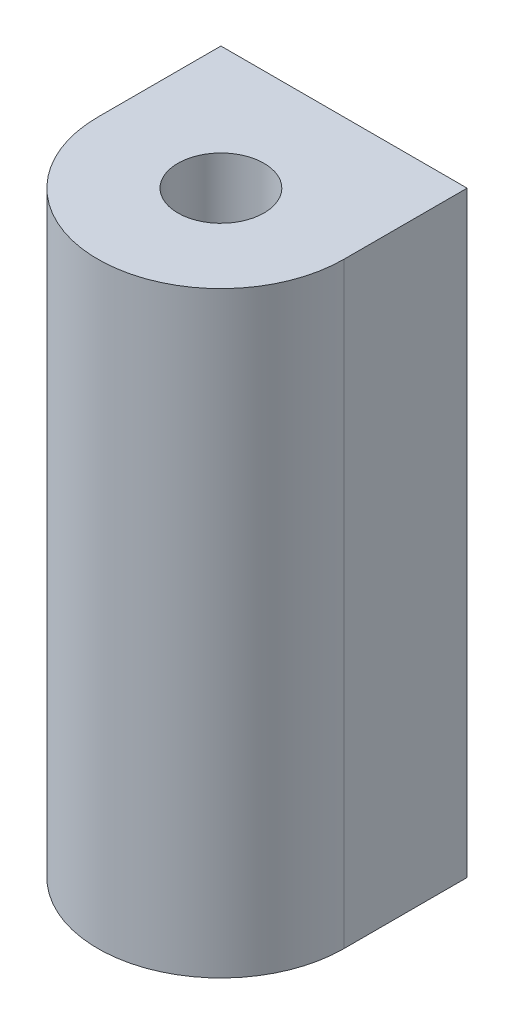
ISO-10303-21;
HEADER;
FILE_DESCRIPTION(('STEP AP214'),'2;1');
FILE_NAME('part.step','',(''),(''),'','','');
FILE_SCHEMA(('AUTOMOTIVE_DESIGN { 1 0 10303 214 1 1 1 1 }'));
ENDSEC;
DATA;
#1=APPLICATION_CONTEXT('core data for automotive mechanical design processes');
#2=APPLICATION_PROTOCOL_DEFINITION('international standard','automotive_design',2000,#1);
#3=PRODUCT_CONTEXT('',#1,'mechanical');
#4=PRODUCT('Part','Part','',(#3));
#5=PRODUCT_RELATED_PRODUCT_CATEGORY('part','',(#4));
#6=PRODUCT_DEFINITION_FORMATION('','',#4);
#7=PRODUCT_DEFINITION_CONTEXT('part definition',#1,'design');
#8=PRODUCT_DEFINITION('design','',#6,#7);
#9=PRODUCT_DEFINITION_SHAPE('','',#8);
#10=(LENGTH_UNIT() NAMED_UNIT(*) SI_UNIT(.MILLI.,.METRE.));
#11=(NAMED_UNIT(*) PLANE_ANGLE_UNIT() SI_UNIT($,.RADIAN.));
#12=(NAMED_UNIT(*) SI_UNIT($,.STERADIAN.) SOLID_ANGLE_UNIT());
#13=UNCERTAINTY_MEASURE_WITH_UNIT(LENGTH_MEASURE(1.E-05),#10,'distance_accuracy_value','');
#14=(GEOMETRIC_REPRESENTATION_CONTEXT(3) GLOBAL_UNCERTAINTY_ASSIGNED_CONTEXT((#13)) GLOBAL_UNIT_ASSIGNED_CONTEXT((#10,
#11,#12)) REPRESENTATION_CONTEXT('',''));
#15=CARTESIAN_POINT('',(0.,0.,0.));
#16=DIRECTION('',(0.,0.,1.));
#17=DIRECTION('',(1.,0.,0.));
#18=AXIS2_PLACEMENT_3D('',#15,#16,#17);
#19=CARTESIAN_POINT('',(-4.,19.4,-4.));
#20=DIRECTION('',(0.,0.,1.));
#21=DIRECTION('',(1.,0.,0.));
#22=AXIS2_PLACEMENT_3D('',#19,#20,#21);
#23=PLANE('',#22);
#24=DIRECTION('',(-1.,0.,0.));
#25=VECTOR('',#24,1.);
#26=CARTESIAN_POINT('',(-4.,0.,-4.));
#27=LINE('',#26,#25);
#28=CARTESIAN_POINT('',(4.,0.,-4.));
#29=VERTEX_POINT('',#28);
#30=CARTESIAN_POINT('',(-4.,0.,-4.));
#31=VERTEX_POINT('',#30);
#32=EDGE_CURVE('E145',#29,#31,#27,.T.);
#33=ORIENTED_EDGE('',*,*,#32,.T.);
#34=DIRECTION('',(0.,-1.,0.));
#35=VECTOR('',#34,1.);
#36=CARTESIAN_POINT('',(-4.,19.4,-4.));
#37=LINE('',#36,#35);
#38=CARTESIAN_POINT('',(-4.,19.4,-4.));
#39=VERTEX_POINT('',#38);
#40=EDGE_CURVE('E150',#39,#31,#37,.T.);
#41=ORIENTED_EDGE('',*,*,#40,.F.);
#42=DIRECTION('',(-1.,0.,0.));
#43=VECTOR('',#42,1.);
#44=CARTESIAN_POINT('',(-4.,19.4,-4.));
#45=LINE('',#44,#43);
#46=CARTESIAN_POINT('',(4.,19.4,-4.));
#47=VERTEX_POINT('',#46);
#48=EDGE_CURVE('E136',#47,#39,#45,.T.);
#49=ORIENTED_EDGE('',*,*,#48,.F.);
#50=DIRECTION('',(0.,-1.,0.));
#51=VECTOR('',#50,1.);
#52=CARTESIAN_POINT('',(4.,19.4,-4.));
#53=LINE('',#52,#51);
#54=EDGE_CURVE('E41',#47,#29,#53,.T.);
#55=ORIENTED_EDGE('',*,*,#54,.T.);
#56=EDGE_LOOP('',(#33,#41,#49,#55));
#57=FACE_BOUND('',#56,.T.);
#58=DIRECTION('',(0.,1.,0.));
#59=VECTOR('',#58,1.);
#60=CARTESIAN_POINT('',(-1.4,17.05,-4.));
#61=LINE('',#60,#59);
#62=CARTESIAN_POINT('',(-1.4,9.25,-4.));
#63=VERTEX_POINT('',#62);
#64=CARTESIAN_POINT('',(-1.4,17.05,-4.));
#65=VERTEX_POINT('',#64);
#66=EDGE_CURVE('E48',#63,#65,#61,.T.);
#67=ORIENTED_EDGE('',*,*,#66,.F.);
#68=DIRECTION('',(-1.,0.,0.));
#69=VECTOR('',#68,1.);
#70=CARTESIAN_POINT('',(1.4,9.25,-4.));
#71=LINE('',#70,#69);
#72=CARTESIAN_POINT('',(1.4,9.25,-4.));
#73=VERTEX_POINT('',#72);
#74=EDGE_CURVE('E52',#73,#63,#71,.T.);
#75=ORIENTED_EDGE('',*,*,#74,.F.);
#76=DIRECTION('',(0.,-1.,0.));
#77=VECTOR('',#76,1.);
#78=CARTESIAN_POINT('',(1.4,17.05,-4.));
#79=LINE('',#78,#77);
#80=CARTESIAN_POINT('',(1.4,17.05,-4.));
#81=VERTEX_POINT('',#80);
#82=EDGE_CURVE('E278',#81,#73,#79,.T.);
#83=ORIENTED_EDGE('',*,*,#82,.F.);
#84=DIRECTION('',(1.,0.,0.));
#85=VECTOR('',#84,1.);
#86=CARTESIAN_POINT('',(1.4,17.05,-4.));
#87=LINE('',#86,#85);
#88=EDGE_CURVE('E284',#65,#81,#87,.T.);
#89=ORIENTED_EDGE('',*,*,#88,.F.);
#90=EDGE_LOOP('',(#67,#75,#83,#89));
#91=FACE_BOUND('',#90,.T.);
#92=ADVANCED_FACE('F33',(#57,#91),#23,.F.);
#93=CARTESIAN_POINT('',(0.,19.4,0.));
#94=DIRECTION('',(0.,1.,0.));
#95=DIRECTION('',(0.,0.,1.));
#96=AXIS2_PLACEMENT_3D('',#93,#94,#95);
#97=PLANE('',#96);
#98=CARTESIAN_POINT('',(0.,19.4,0.));
#99=DIRECTION('',(0.,1.,0.));
#100=DIRECTION('',(0.,0.,1.));
#101=AXIS2_PLACEMENT_3D('',#98,#99,#100);
#102=CIRCLE('',#101,4.);
#103=CARTESIAN_POINT('',(-4.,19.4,0.));
#104=VERTEX_POINT('',#103);
#105=CARTESIAN_POINT('',(4.,19.4,0.));
#106=VERTEX_POINT('',#105);
#107=EDGE_CURVE('E130',#104,#106,#102,.T.);
#108=ORIENTED_EDGE('',*,*,#107,.T.);
#109=DIRECTION('',(0.,0.,-1.));
#110=VECTOR('',#109,1.);
#111=CARTESIAN_POINT('',(4.,19.4,-4.));
#112=LINE('',#111,#110);
#113=EDGE_CURVE('E133',#106,#47,#112,.T.);
#114=ORIENTED_EDGE('',*,*,#113,.T.);
#115=ORIENTED_EDGE('',*,*,#48,.T.);
#116=DIRECTION('',(0.,0.,1.));
#117=VECTOR('',#116,1.);
#118=CARTESIAN_POINT('',(-4.,19.4,0.));
#119=LINE('',#118,#117);
#120=EDGE_CURVE('E138',#39,#104,#119,.T.);
#121=ORIENTED_EDGE('',*,*,#120,.T.);
#122=EDGE_LOOP('',(#108,#114,#115,#121));
#123=FACE_BOUND('',#122,.T.);
#124=CARTESIAN_POINT('',(0.,19.4,0.));
#125=DIRECTION('',(0.,1.,0.));
#126=DIRECTION('',(0.,0.,1.));
#127=AXIS2_PLACEMENT_3D('',#124,#125,#126);
#128=CIRCLE('',#127,1.4);
#129=CARTESIAN_POINT('',(0.,19.4,1.4));
#130=VERTEX_POINT('',#129);
#131=EDGE_CURVE('E121',#130,#130,#128,.T.);
#132=ORIENTED_EDGE('',*,*,#131,.F.);
#133=EDGE_LOOP('',(#132));
#134=FACE_BOUND('',#133,.T.);
#135=ADVANCED_FACE('F172',(#123,#134),#97,.T.);
#136=CARTESIAN_POINT('',(0.,0.,0.));
#137=DIRECTION('',(0.,1.,0.));
#138=DIRECTION('',(0.,0.,1.));
#139=AXIS2_PLACEMENT_3D('',#136,#137,#138);
#140=PLANE('',#139);
#141=CARTESIAN_POINT('',(0.,0.,0.));
#142=DIRECTION('',(0.,1.,0.));
#143=DIRECTION('',(0.,0.,1.));
#144=AXIS2_PLACEMENT_3D('',#141,#142,#143);
#145=CIRCLE('',#144,4.);
#146=CARTESIAN_POINT('',(-4.,0.,0.));
#147=VERTEX_POINT('',#146);
#148=CARTESIAN_POINT('',(4.,0.,0.));
#149=VERTEX_POINT('',#148);
#150=EDGE_CURVE('E128',#147,#149,#145,.T.);
#151=ORIENTED_EDGE('',*,*,#150,.F.);
#152=DIRECTION('',(0.,0.,1.));
#153=VECTOR('',#152,1.);
#154=CARTESIAN_POINT('',(-4.,0.,0.));
#155=LINE('',#154,#153);
#156=EDGE_CURVE('E134',#31,#147,#155,.T.);
#157=ORIENTED_EDGE('',*,*,#156,.F.);
#158=ORIENTED_EDGE('',*,*,#32,.F.);
#159=DIRECTION('',(0.,0.,-1.));
#160=VECTOR('',#159,1.);
#161=CARTESIAN_POINT('',(4.,0.,-4.));
#162=LINE('',#161,#160);
#163=EDGE_CURVE('E143',#149,#29,#162,.T.);
#164=ORIENTED_EDGE('',*,*,#163,.F.);
#165=EDGE_LOOP('',(#151,#157,#158,#164));
#166=FACE_BOUND('',#165,.T.);
#167=CARTESIAN_POINT('',(0.,0.,0.));
#168=DIRECTION('',(0.,1.,0.));
#169=DIRECTION('',(0.,0.,1.));
#170=AXIS2_PLACEMENT_3D('',#167,#168,#169);
#171=CIRCLE('',#170,1.4);
#172=CARTESIAN_POINT('',(0.,0.,1.4));
#173=VERTEX_POINT('',#172);
#174=EDGE_CURVE('E118',#173,#173,#171,.T.);
#175=ORIENTED_EDGE('',*,*,#174,.T.);
#176=EDGE_LOOP('',(#175));
#177=FACE_BOUND('',#176,.T.);
#178=ADVANCED_FACE('F162',(#166,#177),#140,.F.);
#179=CARTESIAN_POINT('',(0.,19.4,0.));
#180=DIRECTION('',(0.,-1.,0.));
#181=DIRECTION('',(0.,0.,-1.));
#182=AXIS2_PLACEMENT_3D('',#179,#180,#181);
#183=CYLINDRICAL_SURFACE('',#182,4.);
#184=ORIENTED_EDGE('',*,*,#150,.T.);
#185=DIRECTION('',(0.,-1.,0.));
#186=VECTOR('',#185,1.);
#187=CARTESIAN_POINT('',(4.,19.4,0.));
#188=LINE('',#187,#186);
#189=EDGE_CURVE('E11',#106,#149,#188,.T.);
#190=ORIENTED_EDGE('',*,*,#189,.F.);
#191=ORIENTED_EDGE('',*,*,#107,.F.);
#192=DIRECTION('',(0.,-1.,0.));
#193=VECTOR('',#192,1.);
#194=CARTESIAN_POINT('',(-4.,19.4,0.));
#195=LINE('',#194,#193);
#196=EDGE_CURVE('E140',#104,#147,#195,.T.);
#197=ORIENTED_EDGE('',*,*,#196,.T.);
#198=EDGE_LOOP('',(#184,#190,#191,#197));
#199=FACE_BOUND('',#198,.T.);
#200=ADVANCED_FACE('F35',(#199),#183,.T.);
#201=CARTESIAN_POINT('',(4.,19.4,-4.));
#202=DIRECTION('',(-1.,0.,0.));
#203=DIRECTION('',(0.,0.,1.));
#204=AXIS2_PLACEMENT_3D('',#201,#202,#203);
#205=PLANE('',#204);
#206=ORIENTED_EDGE('',*,*,#163,.T.);
#207=ORIENTED_EDGE('',*,*,#54,.F.);
#208=ORIENTED_EDGE('',*,*,#113,.F.);
#209=ORIENTED_EDGE('',*,*,#189,.T.);
#210=EDGE_LOOP('',(#206,#207,#208,#209));
#211=FACE_BOUND('',#210,.T.);
#212=ADVANCED_FACE('F174',(#211),#205,.F.);
#213=CARTESIAN_POINT('',(-4.,19.4,0.));
#214=DIRECTION('',(1.,0.,0.));
#215=DIRECTION('',(0.,0.,-1.));
#216=AXIS2_PLACEMENT_3D('',#213,#214,#215);
#217=PLANE('',#216);
#218=ORIENTED_EDGE('',*,*,#156,.T.);
#219=ORIENTED_EDGE('',*,*,#196,.F.);
#220=ORIENTED_EDGE('',*,*,#120,.F.);
#221=ORIENTED_EDGE('',*,*,#40,.T.);
#222=EDGE_LOOP('',(#218,#219,#220,#221));
#223=FACE_BOUND('',#222,.T.);
#224=ADVANCED_FACE('F166',(#223),#217,.F.);
#225=CARTESIAN_POINT('',(0.,19.4,0.));
#226=DIRECTION('',(0.,-1.,0.));
#227=DIRECTION('',(0.,0.,-1.));
#228=AXIS2_PLACEMENT_3D('',#225,#226,#227);
#229=CYLINDRICAL_SURFACE('',#228,1.4);
#230=ORIENTED_EDGE('',*,*,#131,.T.);
#231=EDGE_LOOP('',(#230));
#232=FACE_BOUND('',#231,.T.);
#233=ORIENTED_EDGE('',*,*,#174,.F.);
#234=EDGE_LOOP('',(#233));
#235=FACE_BOUND('',#234,.T.);
#236=ADVANCED_FACE('F180',(#232,#235),#229,.F.);
#237=CARTESIAN_POINT('',(-1.4,17.05,-5.8));
#238=DIRECTION('',(1.,0.,0.));
#239=DIRECTION('',(0.,1.,0.));
#240=AXIS2_PLACEMENT_3D('',#237,#238,#239);
#241=PLANE('',#240);
#242=ORIENTED_EDGE('',*,*,#66,.T.);
#243=DIRECTION('',(0.,0.,1.));
#244=VECTOR('',#243,1.);
#245=CARTESIAN_POINT('',(-1.4,17.05,-5.8));
#246=LINE('',#245,#244);
#247=CARTESIAN_POINT('',(-1.4,17.05,-5.8));
#248=VERTEX_POINT('',#247);
#249=EDGE_CURVE('E101',#248,#65,#246,.T.);
#250=ORIENTED_EDGE('',*,*,#249,.F.);
#251=DIRECTION('',(0.,1.,0.));
#252=VECTOR('',#251,1.);
#253=CARTESIAN_POINT('',(-1.4,17.05,-5.8));
#254=LINE('',#253,#252);
#255=CARTESIAN_POINT('',(-1.4,9.25,-5.8));
#256=VERTEX_POINT('',#255);
#257=EDGE_CURVE('E107',#256,#248,#254,.T.);
#258=ORIENTED_EDGE('',*,*,#257,.F.);
#259=DIRECTION('',(0.,0.,1.));
#260=VECTOR('',#259,1.);
#261=CARTESIAN_POINT('',(-1.4,9.25,-5.8));
#262=LINE('',#261,#260);
#263=EDGE_CURVE('E276',#256,#63,#262,.T.);
#264=ORIENTED_EDGE('',*,*,#263,.T.);
#265=EDGE_LOOP('',(#242,#250,#258,#264));
#266=FACE_BOUND('',#265,.T.);
#267=ADVANCED_FACE('F117',(#266),#241,.F.);
#268=CARTESIAN_POINT('',(1.4,17.05,-5.8));
#269=DIRECTION('',(0.,-1.,0.));
#270=DIRECTION('',(0.,0.,-1.));
#271=AXIS2_PLACEMENT_3D('',#268,#269,#270);
#272=PLANE('',#271);
#273=ORIENTED_EDGE('',*,*,#88,.T.);
#274=DIRECTION('',(0.,0.,1.));
#275=VECTOR('',#274,1.);
#276=CARTESIAN_POINT('',(1.4,17.05,-5.8));
#277=LINE('',#276,#275);
#278=CARTESIAN_POINT('',(1.4,17.05,-5.8));
#279=VERTEX_POINT('',#278);
#280=EDGE_CURVE('E103',#279,#81,#277,.T.);
#281=ORIENTED_EDGE('',*,*,#280,.F.);
#282=DIRECTION('',(1.,0.,0.));
#283=VECTOR('',#282,1.);
#284=CARTESIAN_POINT('',(1.4,17.05,-5.8));
#285=LINE('',#284,#283);
#286=EDGE_CURVE('E96',#248,#279,#285,.T.);
#287=ORIENTED_EDGE('',*,*,#286,.F.);
#288=ORIENTED_EDGE('',*,*,#249,.T.);
#289=EDGE_LOOP('',(#273,#281,#287,#288));
#290=FACE_BOUND('',#289,.T.);
#291=ADVANCED_FACE('F99',(#290),#272,.F.);
#292=CARTESIAN_POINT('',(1.4,17.05,-5.8));
#293=DIRECTION('',(-1.,0.,0.));
#294=DIRECTION('',(0.,-1.,0.));
#295=AXIS2_PLACEMENT_3D('',#292,#293,#294);
#296=PLANE('',#295);
#297=ORIENTED_EDGE('',*,*,#82,.T.);
#298=DIRECTION('',(0.,0.,1.));
#299=VECTOR('',#298,1.);
#300=CARTESIAN_POINT('',(1.4,9.25,-5.8));
#301=LINE('',#300,#299);
#302=CARTESIAN_POINT('',(1.4,9.25,-5.8));
#303=VERTEX_POINT('',#302);
#304=EDGE_CURVE('E123',#303,#73,#301,.T.);
#305=ORIENTED_EDGE('',*,*,#304,.F.);
#306=DIRECTION('',(0.,-1.,0.));
#307=VECTOR('',#306,1.);
#308=CARTESIAN_POINT('',(1.4,17.05,-5.8));
#309=LINE('',#308,#307);
#310=EDGE_CURVE('E106',#279,#303,#309,.T.);
#311=ORIENTED_EDGE('',*,*,#310,.F.);
#312=ORIENTED_EDGE('',*,*,#280,.T.);
#313=EDGE_LOOP('',(#297,#305,#311,#312));
#314=FACE_BOUND('',#313,.T.);
#315=ADVANCED_FACE('F198',(#314),#296,.F.);
#316=CARTESIAN_POINT('',(1.4,9.25,-5.8));
#317=DIRECTION('',(0.,1.,0.));
#318=DIRECTION('',(0.,0.,1.));
#319=AXIS2_PLACEMENT_3D('',#316,#317,#318);
#320=PLANE('',#319);
#321=ORIENTED_EDGE('',*,*,#74,.T.);
#322=ORIENTED_EDGE('',*,*,#263,.F.);
#323=DIRECTION('',(-1.,0.,0.));
#324=VECTOR('',#323,1.);
#325=CARTESIAN_POINT('',(1.4,9.25,-5.8));
#326=LINE('',#325,#324);
#327=EDGE_CURVE('E112',#303,#256,#326,.T.);
#328=ORIENTED_EDGE('',*,*,#327,.F.);
#329=ORIENTED_EDGE('',*,*,#304,.T.);
#330=EDGE_LOOP('',(#321,#322,#328,#329));
#331=FACE_BOUND('',#330,.T.);
#332=ADVANCED_FACE('F201',(#331),#320,.F.);
#333=CARTESIAN_POINT('',(0.,0.,-5.8));
#334=DIRECTION('',(0.,0.,-1.));
#335=DIRECTION('',(-1.,0.,0.));
#336=AXIS2_PLACEMENT_3D('',#333,#334,#335);
#337=PLANE('',#336);
#338=ORIENTED_EDGE('',*,*,#257,.T.);
#339=ORIENTED_EDGE('',*,*,#286,.T.);
#340=ORIENTED_EDGE('',*,*,#310,.T.);
#341=ORIENTED_EDGE('',*,*,#327,.T.);
#342=EDGE_LOOP('',(#338,#339,#340,#341));
#343=FACE_BOUND('',#342,.T.);
#344=ADVANCED_FACE('F110',(#343),#337,.T.);
#345=CLOSED_SHELL('',(#92,#135,#178,#200,#212,#224,#236,#267,#291,#315,#332,#344));
#346=MANIFOLD_SOLID_BREP('B2',#345);
#347=ADVANCED_BREP_SHAPE_REPRESENTATION('',(#18,#346),#14);
#348=SHAPE_DEFINITION_REPRESENTATION(#9,#347);
ENDSEC;
END-ISO-10303-21;
